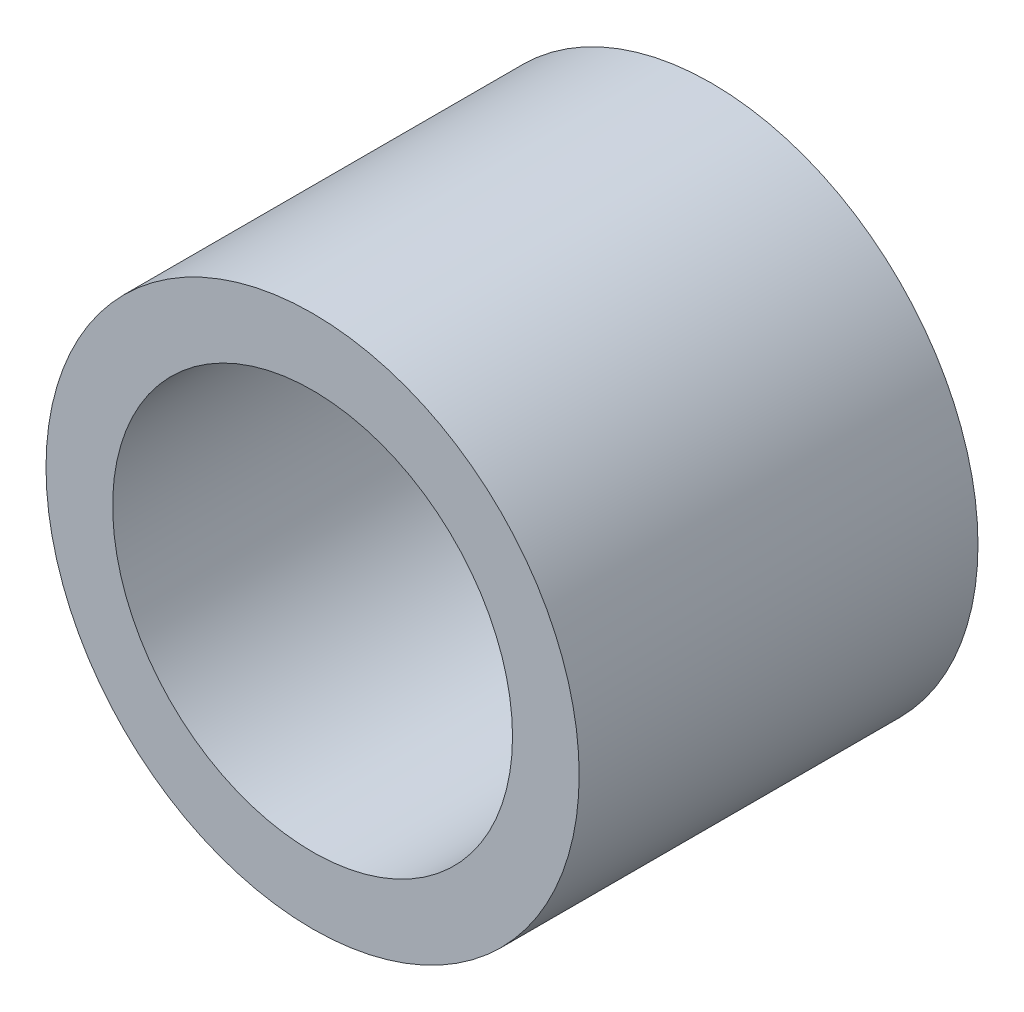
ISO-10303-21;
HEADER;
FILE_DESCRIPTION(('STEP AP214'),'2;1');
FILE_NAME('part.step','',(''),(''),'','','');
FILE_SCHEMA(('AUTOMOTIVE_DESIGN { 1 0 10303 214 1 1 1 1 }'));
ENDSEC;
DATA;
#1=APPLICATION_CONTEXT('core data for automotive mechanical design processes');
#2=APPLICATION_PROTOCOL_DEFINITION('international standard','automotive_design',2000,#1);
#3=PRODUCT_CONTEXT('',#1,'mechanical');
#4=PRODUCT('Part','Part','',(#3));
#5=PRODUCT_RELATED_PRODUCT_CATEGORY('part','',(#4));
#6=PRODUCT_DEFINITION_FORMATION('','',#4);
#7=PRODUCT_DEFINITION_CONTEXT('part definition',#1,'design');
#8=PRODUCT_DEFINITION('design','',#6,#7);
#9=PRODUCT_DEFINITION_SHAPE('','',#8);
#10=(LENGTH_UNIT() NAMED_UNIT(*) SI_UNIT(.MILLI.,.METRE.));
#11=(NAMED_UNIT(*) PLANE_ANGLE_UNIT() SI_UNIT($,.RADIAN.));
#12=(NAMED_UNIT(*) SI_UNIT($,.STERADIAN.) SOLID_ANGLE_UNIT());
#13=UNCERTAINTY_MEASURE_WITH_UNIT(LENGTH_MEASURE(1.E-05),#10,'distance_accuracy_value','');
#14=(GEOMETRIC_REPRESENTATION_CONTEXT(3) GLOBAL_UNCERTAINTY_ASSIGNED_CONTEXT((#13)) GLOBAL_UNIT_ASSIGNED_CONTEXT((#10,
#11,#12)) REPRESENTATION_CONTEXT('',''));
#15=CARTESIAN_POINT('',(0.,0.,0.));
#16=DIRECTION('',(0.,0.,1.));
#17=DIRECTION('',(1.,0.,0.));
#18=AXIS2_PLACEMENT_3D('',#15,#16,#17);
#19=CARTESIAN_POINT('',(0.,0.,9.5));
#20=DIRECTION('',(0.,0.,1.));
#21=DIRECTION('',(1.,0.,0.));
#22=AXIS2_PLACEMENT_3D('',#19,#20,#21);
#23=PLANE('',#22);
#24=CARTESIAN_POINT('',(0.,0.,9.5));
#25=DIRECTION('',(0.,0.,1.));
#26=DIRECTION('',(1.,0.,0.));
#27=AXIS2_PLACEMENT_3D('',#24,#25,#26);
#28=CIRCLE('',#27,12.7);
#29=CARTESIAN_POINT('',(12.7,0.,9.5));
#30=VERTEX_POINT('',#29);
#31=EDGE_CURVE('E10',#30,#30,#28,.T.);
#32=ORIENTED_EDGE('',*,*,#31,.T.);
#33=EDGE_LOOP('',(#32));
#34=FACE_BOUND('',#33,.T.);
#35=CARTESIAN_POINT('',(0.,0.,9.5));
#36=DIRECTION('',(0.,0.,1.));
#37=DIRECTION('',(1.,0.,0.));
#38=AXIS2_PLACEMENT_3D('',#35,#36,#37);
#39=CIRCLE('',#38,9.525);
#40=CARTESIAN_POINT('',(9.525,0.,9.5));
#41=VERTEX_POINT('',#40);
#42=EDGE_CURVE('E50',#41,#41,#39,.T.);
#43=ORIENTED_EDGE('',*,*,#42,.F.);
#44=EDGE_LOOP('',(#43));
#45=FACE_BOUND('',#44,.T.);
#46=ADVANCED_FACE('F37',(#34,#45),#23,.T.);
#47=CARTESIAN_POINT('',(0.,0.,-9.5));
#48=DIRECTION('',(0.,0.,1.));
#49=DIRECTION('',(1.,0.,0.));
#50=AXIS2_PLACEMENT_3D('',#47,#48,#49);
#51=PLANE('',#50);
#52=CARTESIAN_POINT('',(0.,0.,-9.5));
#53=DIRECTION('',(0.,0.,1.));
#54=DIRECTION('',(1.,0.,0.));
#55=AXIS2_PLACEMENT_3D('',#52,#53,#54);
#56=CIRCLE('',#55,12.7);
#57=CARTESIAN_POINT('',(12.7,0.,-9.5));
#58=VERTEX_POINT('',#57);
#59=EDGE_CURVE('E41',#58,#58,#56,.T.);
#60=ORIENTED_EDGE('',*,*,#59,.F.);
#61=EDGE_LOOP('',(#60));
#62=FACE_BOUND('',#61,.T.);
#63=CARTESIAN_POINT('',(0.,0.,-9.5));
#64=DIRECTION('',(0.,0.,1.));
#65=DIRECTION('',(1.,0.,0.));
#66=AXIS2_PLACEMENT_3D('',#63,#64,#65);
#67=CIRCLE('',#66,9.525);
#68=CARTESIAN_POINT('',(9.525,0.,-9.5));
#69=VERTEX_POINT('',#68);
#70=EDGE_CURVE('E52',#69,#69,#67,.T.);
#71=ORIENTED_EDGE('',*,*,#70,.T.);
#72=EDGE_LOOP('',(#71));
#73=FACE_BOUND('',#72,.T.);
#74=ADVANCED_FACE('F64',(#62,#73),#51,.F.);
#75=CARTESIAN_POINT('',(0.,0.,9.5));
#76=DIRECTION('',(0.,0.,-1.));
#77=DIRECTION('',(-1.,0.,0.));
#78=AXIS2_PLACEMENT_3D('',#75,#76,#77);
#79=CYLINDRICAL_SURFACE('',#78,12.7);
#80=ORIENTED_EDGE('',*,*,#31,.F.);
#81=EDGE_LOOP('',(#80));
#82=FACE_BOUND('',#81,.T.);
#83=ORIENTED_EDGE('',*,*,#59,.T.);
#84=EDGE_LOOP('',(#83));
#85=FACE_BOUND('',#84,.T.);
#86=ADVANCED_FACE('F39',(#82,#85),#79,.T.);
#87=CARTESIAN_POINT('',(0.,0.,9.5));
#88=DIRECTION('',(0.,0.,-1.));
#89=DIRECTION('',(-1.,0.,0.));
#90=AXIS2_PLACEMENT_3D('',#87,#88,#89);
#91=CYLINDRICAL_SURFACE('',#90,9.525);
#92=ORIENTED_EDGE('',*,*,#42,.T.);
#93=EDGE_LOOP('',(#92));
#94=FACE_BOUND('',#93,.T.);
#95=ORIENTED_EDGE('',*,*,#70,.F.);
#96=EDGE_LOOP('',(#95));
#97=FACE_BOUND('',#96,.T.);
#98=ADVANCED_FACE('F60',(#94,#97),#91,.F.);
#99=CLOSED_SHELL('',(#46,#74,#86,#98));
#100=MANIFOLD_SOLID_BREP('B2',#99);
#101=ADVANCED_BREP_SHAPE_REPRESENTATION('',(#18,#100),#14);
#102=SHAPE_DEFINITION_REPRESENTATION(#9,#101);
ENDSEC;
END-ISO-10303-21;
